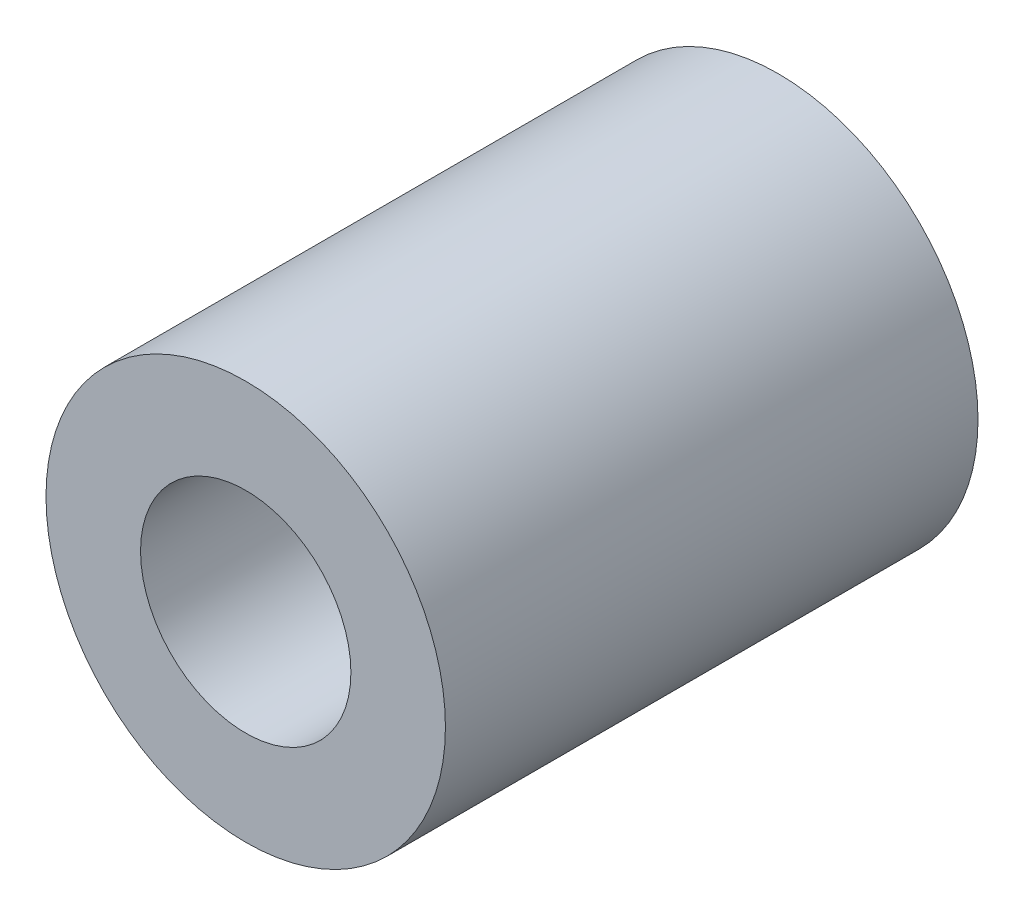
ISO-10303-21;
HEADER;
FILE_DESCRIPTION(('STEP AP214'),'2;1');
FILE_NAME('part.step','',(''),(''),'','','');
FILE_SCHEMA(('AUTOMOTIVE_DESIGN { 1 0 10303 214 1 1 1 1 }'));
ENDSEC;
DATA;
#1=APPLICATION_CONTEXT('core data for automotive mechanical design processes');
#2=APPLICATION_PROTOCOL_DEFINITION('international standard','automotive_design',2000,#1);
#3=PRODUCT_CONTEXT('',#1,'mechanical');
#4=PRODUCT('Part','Part','',(#3));
#5=PRODUCT_RELATED_PRODUCT_CATEGORY('part','',(#4));
#6=PRODUCT_DEFINITION_FORMATION('','',#4);
#7=PRODUCT_DEFINITION_CONTEXT('part definition',#1,'design');
#8=PRODUCT_DEFINITION('design','',#6,#7);
#9=PRODUCT_DEFINITION_SHAPE('','',#8);
#10=(LENGTH_UNIT() NAMED_UNIT(*) SI_UNIT(.MILLI.,.METRE.));
#11=(NAMED_UNIT(*) PLANE_ANGLE_UNIT() SI_UNIT($,.RADIAN.));
#12=(NAMED_UNIT(*) SI_UNIT($,.STERADIAN.) SOLID_ANGLE_UNIT());
#13=UNCERTAINTY_MEASURE_WITH_UNIT(LENGTH_MEASURE(1.E-05),#10,'distance_accuracy_value','');
#14=(GEOMETRIC_REPRESENTATION_CONTEXT(3) GLOBAL_UNCERTAINTY_ASSIGNED_CONTEXT((#13)) GLOBAL_UNIT_ASSIGNED_CONTEXT((#10,
#11,#12)) REPRESENTATION_CONTEXT('',''));
#15=CARTESIAN_POINT('',(0.,0.,0.));
#16=DIRECTION('',(0.,0.,1.));
#17=DIRECTION('',(1.,0.,0.));
#18=AXIS2_PLACEMENT_3D('',#15,#16,#17);
#19=CARTESIAN_POINT('',(0.,0.,50.8));
#20=DIRECTION('',(0.,0.,1.));
#21=DIRECTION('',(1.,0.,0.));
#22=AXIS2_PLACEMENT_3D('',#19,#20,#21);
#23=PLANE('',#22);
#24=CARTESIAN_POINT('',(0.,0.,50.8));
#25=DIRECTION('',(0.,0.,1.));
#26=DIRECTION('',(1.,0.,0.));
#27=AXIS2_PLACEMENT_3D('',#24,#25,#26);
#28=CIRCLE('',#27,19.05);
#29=CARTESIAN_POINT('',(19.05,0.,50.8));
#30=VERTEX_POINT('',#29);
#31=EDGE_CURVE('E10',#30,#30,#28,.T.);
#32=ORIENTED_EDGE('',*,*,#31,.T.);
#33=EDGE_LOOP('',(#32));
#34=FACE_BOUND('',#33,.T.);
#35=CARTESIAN_POINT('',(0.,0.,50.8));
#36=DIRECTION('',(0.,0.,1.));
#37=DIRECTION('',(1.,0.,0.));
#38=AXIS2_PLACEMENT_3D('',#35,#36,#37);
#39=CIRCLE('',#38,10.033);
#40=CARTESIAN_POINT('',(10.033,0.,50.8));
#41=VERTEX_POINT('',#40);
#42=EDGE_CURVE('E42',#41,#41,#39,.T.);
#43=ORIENTED_EDGE('',*,*,#42,.F.);
#44=EDGE_LOOP('',(#43));
#45=FACE_BOUND('',#44,.T.);
#46=ADVANCED_FACE('F31',(#34,#45),#23,.T.);
#47=CARTESIAN_POINT('',(0.,0.,0.));
#48=DIRECTION('',(0.,0.,1.));
#49=DIRECTION('',(1.,0.,0.));
#50=AXIS2_PLACEMENT_3D('',#47,#48,#49);
#51=PLANE('',#50);
#52=CARTESIAN_POINT('',(0.,0.,0.));
#53=DIRECTION('',(0.,0.,1.));
#54=DIRECTION('',(1.,0.,0.));
#55=AXIS2_PLACEMENT_3D('',#52,#53,#54);
#56=CIRCLE('',#55,19.05);
#57=CARTESIAN_POINT('',(19.05,0.,0.));
#58=VERTEX_POINT('',#57);
#59=EDGE_CURVE('E35',#58,#58,#56,.T.);
#60=ORIENTED_EDGE('',*,*,#59,.F.);
#61=EDGE_LOOP('',(#60));
#62=FACE_BOUND('',#61,.T.);
#63=CARTESIAN_POINT('',(0.,0.,0.));
#64=DIRECTION('',(0.,0.,1.));
#65=DIRECTION('',(1.,0.,0.));
#66=AXIS2_PLACEMENT_3D('',#63,#64,#65);
#67=CIRCLE('',#66,10.033);
#68=CARTESIAN_POINT('',(10.033,0.,0.));
#69=VERTEX_POINT('',#68);
#70=EDGE_CURVE('E44',#69,#69,#67,.T.);
#71=ORIENTED_EDGE('',*,*,#70,.T.);
#72=EDGE_LOOP('',(#71));
#73=FACE_BOUND('',#72,.T.);
#74=ADVANCED_FACE('F54',(#62,#73),#51,.F.);
#75=CARTESIAN_POINT('',(0.,0.,50.8));
#76=DIRECTION('',(0.,0.,-1.));
#77=DIRECTION('',(-1.,0.,0.));
#78=AXIS2_PLACEMENT_3D('',#75,#76,#77);
#79=CYLINDRICAL_SURFACE('',#78,19.05);
#80=ORIENTED_EDGE('',*,*,#31,.F.);
#81=EDGE_LOOP('',(#80));
#82=FACE_BOUND('',#81,.T.);
#83=ORIENTED_EDGE('',*,*,#59,.T.);
#84=EDGE_LOOP('',(#83));
#85=FACE_BOUND('',#84,.T.);
#86=ADVANCED_FACE('F33',(#82,#85),#79,.T.);
#87=CARTESIAN_POINT('',(0.,0.,50.8));
#88=DIRECTION('',(0.,0.,-1.));
#89=DIRECTION('',(-1.,0.,0.));
#90=AXIS2_PLACEMENT_3D('',#87,#88,#89);
#91=CYLINDRICAL_SURFACE('',#90,10.033);
#92=ORIENTED_EDGE('',*,*,#42,.T.);
#93=EDGE_LOOP('',(#92));
#94=FACE_BOUND('',#93,.T.);
#95=ORIENTED_EDGE('',*,*,#70,.F.);
#96=EDGE_LOOP('',(#95));
#97=FACE_BOUND('',#96,.T.);
#98=ADVANCED_FACE('F50',(#94,#97),#91,.F.);
#99=CLOSED_SHELL('',(#46,#74,#86,#98));
#100=MANIFOLD_SOLID_BREP('B2',#99);
#101=ADVANCED_BREP_SHAPE_REPRESENTATION('',(#18,#100),#14);
#102=SHAPE_DEFINITION_REPRESENTATION(#9,#101);
ENDSEC;
END-ISO-10303-21;
